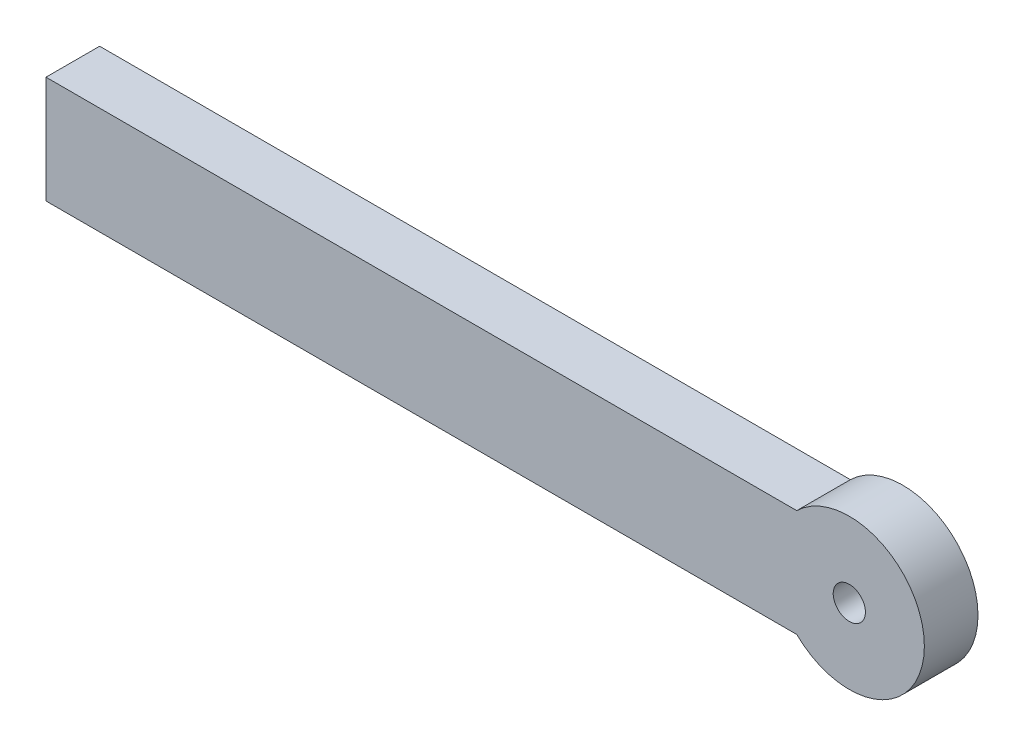
ISO-10303-21;
HEADER;
FILE_DESCRIPTION(('STEP AP214'),'2;1');
FILE_NAME('part.step','',(''),(''),'','','');
FILE_SCHEMA(('AUTOMOTIVE_DESIGN { 1 0 10303 214 1 1 1 1 }'));
ENDSEC;
DATA;
#1=APPLICATION_CONTEXT('core data for automotive mechanical design processes');
#2=APPLICATION_PROTOCOL_DEFINITION('international standard','automotive_design',2000,#1);
#3=PRODUCT_CONTEXT('',#1,'mechanical');
#4=PRODUCT('Part','Part','',(#3));
#5=PRODUCT_RELATED_PRODUCT_CATEGORY('part','',(#4));
#6=PRODUCT_DEFINITION_FORMATION('','',#4);
#7=PRODUCT_DEFINITION_CONTEXT('part definition',#1,'design');
#8=PRODUCT_DEFINITION('design','',#6,#7);
#9=PRODUCT_DEFINITION_SHAPE('','',#8);
#10=(LENGTH_UNIT() NAMED_UNIT(*) SI_UNIT(.MILLI.,.METRE.));
#11=(NAMED_UNIT(*) PLANE_ANGLE_UNIT() SI_UNIT($,.RADIAN.));
#12=(NAMED_UNIT(*) SI_UNIT($,.STERADIAN.) SOLID_ANGLE_UNIT());
#13=UNCERTAINTY_MEASURE_WITH_UNIT(LENGTH_MEASURE(1.E-05),#10,'distance_accuracy_value','');
#14=(GEOMETRIC_REPRESENTATION_CONTEXT(3) GLOBAL_UNCERTAINTY_ASSIGNED_CONTEXT((#13)) GLOBAL_UNIT_ASSIGNED_CONTEXT((#10,
#11,#12)) REPRESENTATION_CONTEXT('',''));
#15=CARTESIAN_POINT('',(0.,0.,0.));
#16=DIRECTION('',(0.,0.,1.));
#17=DIRECTION('',(1.,0.,0.));
#18=AXIS2_PLACEMENT_3D('',#15,#16,#17);
#19=CARTESIAN_POINT('',(0.,0.,5.));
#20=DIRECTION('',(0.,0.,1.));
#21=DIRECTION('',(1.,0.,0.));
#22=AXIS2_PLACEMENT_3D('',#19,#20,#21);
#23=PLANE('',#22);
#24=DIRECTION('',(0.,-1.,0.));
#25=VECTOR('',#24,1.);
#26=CARTESIAN_POINT('',(-74.8989794855664,5.,5.));
#27=LINE('',#26,#25);
#28=CARTESIAN_POINT('',(-74.8989794855664,5.,5.));
#29=VERTEX_POINT('',#28);
#30=CARTESIAN_POINT('',(-74.8989794855664,-5.00000000000001,5.));
#31=VERTEX_POINT('',#30);
#32=EDGE_CURVE('E84',#29,#31,#27,.T.);
#33=ORIENTED_EDGE('',*,*,#32,.T.);
#34=DIRECTION('',(1.,0.,0.));
#35=VECTOR('',#34,1.);
#36=CARTESIAN_POINT('',(-74.8989794855664,-5.00000000000001,5.));
#37=LINE('',#36,#35);
#38=CARTESIAN_POINT('',(-4.89897948556635,-5.,5.));
#39=VERTEX_POINT('',#38);
#40=EDGE_CURVE('E79',#31,#39,#37,.T.);
#41=ORIENTED_EDGE('',*,*,#40,.T.);
#42=CARTESIAN_POINT('',(0.,0.,5.));
#43=DIRECTION('',(0.,0.,1.));
#44=DIRECTION('',(1.,0.,0.));
#45=AXIS2_PLACEMENT_3D('',#42,#43,#44);
#46=CIRCLE('',#45,7.);
#47=CARTESIAN_POINT('',(-4.89897948556636,5.,5.));
#48=VERTEX_POINT('',#47);
#49=EDGE_CURVE('E82',#39,#48,#46,.T.);
#50=ORIENTED_EDGE('',*,*,#49,.T.);
#51=DIRECTION('',(-1.,0.,0.));
#52=VECTOR('',#51,1.);
#53=CARTESIAN_POINT('',(-74.8989794855664,5.,5.));
#54=LINE('',#53,#52);
#55=EDGE_CURVE('E49',#48,#29,#54,.T.);
#56=ORIENTED_EDGE('',*,*,#55,.T.);
#57=EDGE_LOOP('',(#33,#41,#50,#56));
#58=FACE_BOUND('',#57,.T.);
#59=CARTESIAN_POINT('',(0.,0.,5.));
#60=DIRECTION('',(0.,0.,1.));
#61=DIRECTION('',(1.,0.,0.));
#62=AXIS2_PLACEMENT_3D('',#59,#60,#61);
#63=CIRCLE('',#62,1.5);
#64=CARTESIAN_POINT('',(1.5,0.,5.));
#65=VERTEX_POINT('',#64);
#66=EDGE_CURVE('E99',#65,#65,#63,.T.);
#67=ORIENTED_EDGE('',*,*,#66,.F.);
#68=EDGE_LOOP('',(#67));
#69=FACE_BOUND('',#68,.T.);
#70=ADVANCED_FACE('F32',(#58,#69),#23,.T.);
#71=CARTESIAN_POINT('',(0.,0.,0.));
#72=DIRECTION('',(0.,0.,1.));
#73=DIRECTION('',(1.,0.,0.));
#74=AXIS2_PLACEMENT_3D('',#71,#72,#73);
#75=PLANE('',#74);
#76=DIRECTION('',(0.,-1.,0.));
#77=VECTOR('',#76,1.);
#78=CARTESIAN_POINT('',(-74.8989794855664,5.,0.));
#79=LINE('',#78,#77);
#80=CARTESIAN_POINT('',(-74.8989794855664,5.,0.));
#81=VERTEX_POINT('',#80);
#82=CARTESIAN_POINT('',(-74.8989794855664,-5.00000000000001,0.));
#83=VERTEX_POINT('',#82);
#84=EDGE_CURVE('E96',#81,#83,#79,.T.);
#85=ORIENTED_EDGE('',*,*,#84,.F.);
#86=DIRECTION('',(-1.,0.,0.));
#87=VECTOR('',#86,1.);
#88=CARTESIAN_POINT('',(-74.8989794855664,5.,0.));
#89=LINE('',#88,#87);
#90=CARTESIAN_POINT('',(-4.89897948556636,5.,0.));
#91=VERTEX_POINT('',#90);
#92=EDGE_CURVE('E72',#91,#81,#89,.T.);
#93=ORIENTED_EDGE('',*,*,#92,.F.);
#94=CARTESIAN_POINT('',(0.,0.,0.));
#95=DIRECTION('',(0.,0.,1.));
#96=DIRECTION('',(1.,0.,0.));
#97=AXIS2_PLACEMENT_3D('',#94,#95,#96);
#98=CIRCLE('',#97,7.);
#99=CARTESIAN_POINT('',(-4.89897948556635,-5.,0.));
#100=VERTEX_POINT('',#99);
#101=EDGE_CURVE('E66',#100,#91,#98,.T.);
#102=ORIENTED_EDGE('',*,*,#101,.F.);
#103=DIRECTION('',(1.,0.,0.));
#104=VECTOR('',#103,1.);
#105=CARTESIAN_POINT('',(-74.8989794855664,-5.00000000000001,0.));
#106=LINE('',#105,#104);
#107=EDGE_CURVE('E88',#83,#100,#106,.T.);
#108=ORIENTED_EDGE('',*,*,#107,.F.);
#109=EDGE_LOOP('',(#85,#93,#102,#108));
#110=FACE_BOUND('',#109,.T.);
#111=CARTESIAN_POINT('',(0.,0.,0.));
#112=DIRECTION('',(0.,0.,1.));
#113=DIRECTION('',(1.,0.,0.));
#114=AXIS2_PLACEMENT_3D('',#111,#112,#113);
#115=CIRCLE('',#114,1.5);
#116=CARTESIAN_POINT('',(1.5,0.,0.));
#117=VERTEX_POINT('',#116);
#118=EDGE_CURVE('E111',#117,#117,#115,.T.);
#119=ORIENTED_EDGE('',*,*,#118,.T.);
#120=EDGE_LOOP('',(#119));
#121=FACE_BOUND('',#120,.T.);
#122=ADVANCED_FACE('F107',(#110,#121),#75,.F.);
#123=CARTESIAN_POINT('',(-74.8989794855664,5.,5.));
#124=DIRECTION('',(1.,0.,0.));
#125=DIRECTION('',(0.,1.,0.));
#126=AXIS2_PLACEMENT_3D('',#123,#124,#125);
#127=PLANE('',#126);
#128=ORIENTED_EDGE('',*,*,#84,.T.);
#129=DIRECTION('',(0.,0.,-1.));
#130=VECTOR('',#129,1.);
#131=CARTESIAN_POINT('',(-74.8989794855664,-5.00000000000001,5.));
#132=LINE('',#131,#130);
#133=EDGE_CURVE('E11',#31,#83,#132,.T.);
#134=ORIENTED_EDGE('',*,*,#133,.F.);
#135=ORIENTED_EDGE('',*,*,#32,.F.);
#136=DIRECTION('',(0.,0.,-1.));
#137=VECTOR('',#136,1.);
#138=CARTESIAN_POINT('',(-74.8989794855664,5.,5.));
#139=LINE('',#138,#137);
#140=EDGE_CURVE('E92',#29,#81,#139,.T.);
#141=ORIENTED_EDGE('',*,*,#140,.T.);
#142=EDGE_LOOP('',(#128,#134,#135,#141));
#143=FACE_BOUND('',#142,.T.);
#144=ADVANCED_FACE('F34',(#143),#127,.F.);
#145=CARTESIAN_POINT('',(-74.8989794855664,-5.00000000000001,5.));
#146=DIRECTION('',(0.,1.,0.));
#147=DIRECTION('',(-1.,0.,0.));
#148=AXIS2_PLACEMENT_3D('',#145,#146,#147);
#149=PLANE('',#148);
#150=ORIENTED_EDGE('',*,*,#107,.T.);
#151=DIRECTION('',(0.,0.,-1.));
#152=VECTOR('',#151,1.);
#153=CARTESIAN_POINT('',(-4.89897948556635,-5.,5.));
#154=LINE('',#153,#152);
#155=EDGE_CURVE('E41',#39,#100,#154,.T.);
#156=ORIENTED_EDGE('',*,*,#155,.F.);
#157=ORIENTED_EDGE('',*,*,#40,.F.);
#158=ORIENTED_EDGE('',*,*,#133,.T.);
#159=EDGE_LOOP('',(#150,#156,#157,#158));
#160=FACE_BOUND('',#159,.T.);
#161=ADVANCED_FACE('F87',(#160),#149,.F.);
#162=CARTESIAN_POINT('',(0.,0.,5.));
#163=DIRECTION('',(0.,0.,-1.));
#164=DIRECTION('',(-1.,0.,0.));
#165=AXIS2_PLACEMENT_3D('',#162,#163,#164);
#166=CYLINDRICAL_SURFACE('',#165,7.);
#167=ORIENTED_EDGE('',*,*,#101,.T.);
#168=DIRECTION('',(0.,0.,-1.));
#169=VECTOR('',#168,1.);
#170=CARTESIAN_POINT('',(-4.89897948556636,5.,5.));
#171=LINE('',#170,#169);
#172=EDGE_CURVE('E89',#48,#91,#171,.T.);
#173=ORIENTED_EDGE('',*,*,#172,.F.);
#174=ORIENTED_EDGE('',*,*,#49,.F.);
#175=ORIENTED_EDGE('',*,*,#155,.T.);
#176=EDGE_LOOP('',(#167,#173,#174,#175));
#177=FACE_BOUND('',#176,.T.);
#178=ADVANCED_FACE('F90',(#177),#166,.T.);
#179=CARTESIAN_POINT('',(-74.8989794855664,5.,5.));
#180=DIRECTION('',(0.,-1.,0.));
#181=DIRECTION('',(0.,0.,-1.));
#182=AXIS2_PLACEMENT_3D('',#179,#180,#181);
#183=PLANE('',#182);
#184=ORIENTED_EDGE('',*,*,#92,.T.);
#185=ORIENTED_EDGE('',*,*,#140,.F.);
#186=ORIENTED_EDGE('',*,*,#55,.F.);
#187=ORIENTED_EDGE('',*,*,#172,.T.);
#188=EDGE_LOOP('',(#184,#185,#186,#187));
#189=FACE_BOUND('',#188,.T.);
#190=ADVANCED_FACE('F104',(#189),#183,.F.);
#191=CARTESIAN_POINT('',(0.,0.,5.));
#192=DIRECTION('',(0.,0.,-1.));
#193=DIRECTION('',(-1.,0.,0.));
#194=AXIS2_PLACEMENT_3D('',#191,#192,#193);
#195=CYLINDRICAL_SURFACE('',#194,1.5);
#196=ORIENTED_EDGE('',*,*,#66,.T.);
#197=EDGE_LOOP('',(#196));
#198=FACE_BOUND('',#197,.T.);
#199=ORIENTED_EDGE('',*,*,#118,.F.);
#200=EDGE_LOOP('',(#199));
#201=FACE_BOUND('',#200,.T.);
#202=ADVANCED_FACE('F117',(#198,#201),#195,.F.);
#203=CLOSED_SHELL('',(#70,#122,#144,#161,#178,#190,#202));
#204=MANIFOLD_SOLID_BREP('B2',#203);
#205=ADVANCED_BREP_SHAPE_REPRESENTATION('',(#18,#204),#14);
#206=SHAPE_DEFINITION_REPRESENTATION(#9,#205);
ENDSEC;
END-ISO-10303-21;
